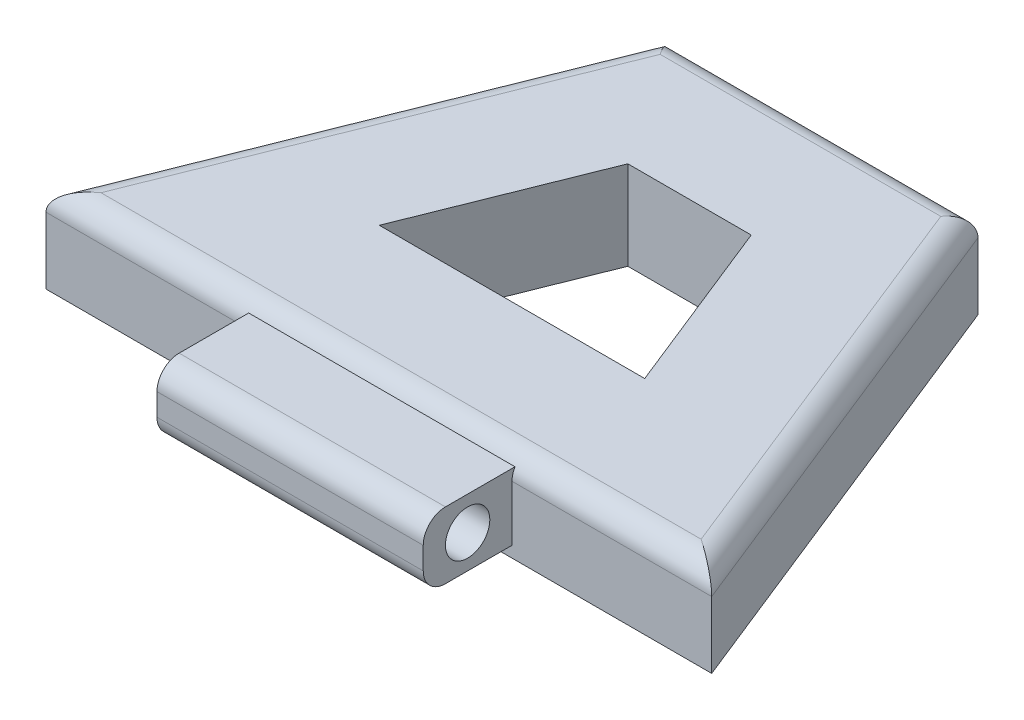
ISO-10303-21;
HEADER;
FILE_DESCRIPTION(('STEP AP214'),'2;1');
FILE_NAME('part.step','',(''),(''),'','','');
FILE_SCHEMA(('AUTOMOTIVE_DESIGN { 1 0 10303 214 1 1 1 1 }'));
ENDSEC;
DATA;
#1=APPLICATION_CONTEXT('core data for automotive mechanical design processes');
#2=APPLICATION_PROTOCOL_DEFINITION('international standard','automotive_design',2000,#1);
#3=PRODUCT_CONTEXT('',#1,'mechanical');
#4=PRODUCT('Part','Part','',(#3));
#5=PRODUCT_RELATED_PRODUCT_CATEGORY('part','',(#4));
#6=PRODUCT_DEFINITION_FORMATION('','',#4);
#7=PRODUCT_DEFINITION_CONTEXT('part definition',#1,'design');
#8=PRODUCT_DEFINITION('design','',#6,#7);
#9=PRODUCT_DEFINITION_SHAPE('','',#8);
#10=(LENGTH_UNIT() NAMED_UNIT(*) SI_UNIT(.MILLI.,.METRE.));
#11=(NAMED_UNIT(*) PLANE_ANGLE_UNIT() SI_UNIT($,.RADIAN.));
#12=(NAMED_UNIT(*) SI_UNIT($,.STERADIAN.) SOLID_ANGLE_UNIT());
#13=UNCERTAINTY_MEASURE_WITH_UNIT(LENGTH_MEASURE(1.E-05),#10,'distance_accuracy_value','');
#14=(GEOMETRIC_REPRESENTATION_CONTEXT(3) GLOBAL_UNCERTAINTY_ASSIGNED_CONTEXT((#13)) GLOBAL_UNIT_ASSIGNED_CONTEXT((#10,
#11,#12)) REPRESENTATION_CONTEXT('',''));
#15=CARTESIAN_POINT('',(0.,0.,0.));
#16=DIRECTION('',(0.,0.,1.));
#17=DIRECTION('',(1.,0.,0.));
#18=AXIS2_PLACEMENT_3D('',#15,#16,#17);
#19=CARTESIAN_POINT('',(75.,20.,0.));
#20=DIRECTION('',(0.,0.,-1.));
#21=DIRECTION('',(-1.,0.,0.));
#22=AXIS2_PLACEMENT_3D('',#19,#20,#21);
#23=PLANE('',#22);
#24=DIRECTION('',(0.,-1.,0.));
#25=VECTOR('',#24,1.);
#26=CARTESIAN_POINT('',(75.,20.,0.));
#27=LINE('',#26,#25);
#28=CARTESIAN_POINT('',(75.,15.,0.));
#29=VERTEX_POINT('',#28);
#30=CARTESIAN_POINT('',(75.,0.,0.));
#31=VERTEX_POINT('',#30);
#32=EDGE_CURVE('E236',#29,#31,#27,.T.);
#33=ORIENTED_EDGE('',*,*,#32,.F.);
#34=DIRECTION('',(1.,0.,0.));
#35=VECTOR('',#34,1.);
#36=CARTESIAN_POINT('',(75.,15.,0.));
#37=LINE('',#36,#35);
#38=CARTESIAN_POINT('',(30.,15.,0.));
#39=VERTEX_POINT('',#38);
#40=EDGE_CURVE('E177',#29,#39,#37,.F.);
#41=ORIENTED_EDGE('',*,*,#40,.T.);
#42=DIRECTION('',(0.,-1.,0.));
#43=VECTOR('',#42,1.);
#44=CARTESIAN_POINT('',(30.,17.5,0.));
#45=LINE('',#44,#43);
#46=CARTESIAN_POINT('',(30.,2.5,0.));
#47=VERTEX_POINT('',#46);
#48=EDGE_CURVE('E163',#39,#47,#45,.T.);
#49=ORIENTED_EDGE('',*,*,#48,.T.);
#50=DIRECTION('',(1.,0.,0.));
#51=VECTOR('',#50,1.);
#52=CARTESIAN_POINT('',(-30.,2.5,0.));
#53=LINE('',#52,#51);
#54=CARTESIAN_POINT('',(-30.,2.5,0.));
#55=VERTEX_POINT('',#54);
#56=EDGE_CURVE('E175',#55,#47,#53,.T.);
#57=ORIENTED_EDGE('',*,*,#56,.F.);
#58=DIRECTION('',(0.,-1.,0.));
#59=VECTOR('',#58,1.);
#60=CARTESIAN_POINT('',(-30.,17.5,0.));
#61=LINE('',#60,#59);
#62=CARTESIAN_POINT('',(-30.,15.,0.));
#63=VERTEX_POINT('',#62);
#64=EDGE_CURVE('E183',#63,#55,#61,.T.);
#65=ORIENTED_EDGE('',*,*,#64,.F.);
#66=DIRECTION('',(1.,0.,0.));
#67=VECTOR('',#66,1.);
#68=CARTESIAN_POINT('',(75.,15.,0.));
#69=LINE('',#68,#67);
#70=CARTESIAN_POINT('',(-75.,15.,0.));
#71=VERTEX_POINT('',#70);
#72=EDGE_CURVE('E253',#63,#71,#69,.F.);
#73=ORIENTED_EDGE('',*,*,#72,.T.);
#74=DIRECTION('',(0.,-1.,0.));
#75=VECTOR('',#74,1.);
#76=CARTESIAN_POINT('',(-75.,20.,0.));
#77=LINE('',#76,#75);
#78=CARTESIAN_POINT('',(-75.,0.,0.));
#79=VERTEX_POINT('',#78);
#80=EDGE_CURVE('E238',#71,#79,#77,.T.);
#81=ORIENTED_EDGE('',*,*,#80,.T.);
#82=DIRECTION('',(1.,0.,0.));
#83=VECTOR('',#82,1.);
#84=CARTESIAN_POINT('',(75.,0.,0.));
#85=LINE('',#84,#83);
#86=EDGE_CURVE('E233',#79,#31,#85,.T.);
#87=ORIENTED_EDGE('',*,*,#86,.T.);
#88=EDGE_LOOP('',(#33,#41,#49,#57,#65,#73,#81,#87));
#89=FACE_BOUND('',#88,.T.);
#90=ADVANCED_FACE('F38',(#89),#23,.F.);
#91=CARTESIAN_POINT('',(0.,20.,0.));
#92=DIRECTION('',(0.,-1.,0.));
#93=DIRECTION('',(0.,0.,-1.));
#94=AXIS2_PLACEMENT_3D('',#91,#92,#93);
#95=PLANE('',#94);
#96=DIRECTION('',(-0.371390676354103,0.,0.92847669088526));
#97=VECTOR('',#96,1.);
#98=CARTESIAN_POINT('',(-60.0127889593668,20.,-24.0051155837467));
#99=LINE('',#98,#97);
#100=CARTESIAN_POINT('',(-31.6148351928655,20.,-95.));
#101=VERTEX_POINT('',#100);
#102=CARTESIAN_POINT('',(-67.6148351928655,20.,-4.99999999999999));
#103=VERTEX_POINT('',#102);
#104=EDGE_CURVE('E248',#101,#103,#99,.T.);
#105=ORIENTED_EDGE('',*,*,#104,.T.);
#106=DIRECTION('',(1.,0.,0.));
#107=VECTOR('',#106,1.);
#108=CARTESIAN_POINT('',(0.,20.,-4.99999999999999));
#109=LINE('',#108,#107);
#110=CARTESIAN_POINT('',(67.6148351928655,20.,-5.));
#111=VERTEX_POINT('',#110);
#112=EDGE_CURVE('E250',#103,#111,#109,.T.);
#113=ORIENTED_EDGE('',*,*,#112,.T.);
#114=DIRECTION('',(-0.371390676354104,0.,-0.92847669088526));
#115=VECTOR('',#114,1.);
#116=CARTESIAN_POINT('',(60.0127889593668,20.,-24.0051155837467));
#117=LINE('',#116,#115);
#118=CARTESIAN_POINT('',(31.6148351928655,20.,-95.));
#119=VERTEX_POINT('',#118);
#120=EDGE_CURVE('E244',#111,#119,#117,.T.);
#121=ORIENTED_EDGE('',*,*,#120,.T.);
#122=DIRECTION('',(-1.,0.,0.));
#123=VECTOR('',#122,1.);
#124=CARTESIAN_POINT('',(0.,20.,-95.));
#125=LINE('',#124,#123);
#126=EDGE_CURVE('E246',#119,#101,#125,.T.);
#127=ORIENTED_EDGE('',*,*,#126,.T.);
#128=EDGE_LOOP('',(#105,#113,#121,#127));
#129=FACE_BOUND('',#128,.T.);
#130=DIRECTION('',(-0.371390676354104,0.,-0.928476690885259));
#131=VECTOR('',#130,1.);
#132=CARTESIAN_POINT('',(13.9,20.,-70.));
#133=LINE('',#132,#131);
#134=CARTESIAN_POINT('',(29.9,20.,-30.));
#135=VERTEX_POINT('',#134);
#136=CARTESIAN_POINT('',(13.9,20.,-70.));
#137=VERTEX_POINT('',#136);
#138=EDGE_CURVE('E194',#135,#137,#133,.T.);
#139=ORIENTED_EDGE('',*,*,#138,.F.);
#140=DIRECTION('',(1.,0.,0.));
#141=VECTOR('',#140,1.);
#142=CARTESIAN_POINT('',(-29.9,20.,-30.));
#143=LINE('',#142,#141);
#144=CARTESIAN_POINT('',(-29.9,20.,-30.));
#145=VERTEX_POINT('',#144);
#146=EDGE_CURVE('E202',#145,#135,#143,.T.);
#147=ORIENTED_EDGE('',*,*,#146,.F.);
#148=DIRECTION('',(-0.371390676354103,0.,0.928476690885259));
#149=VECTOR('',#148,1.);
#150=CARTESIAN_POINT('',(-13.9,20.,-70.));
#151=LINE('',#150,#149);
#152=CARTESIAN_POINT('',(-13.9,20.,-70.));
#153=VERTEX_POINT('',#152);
#154=EDGE_CURVE('E199',#153,#145,#151,.T.);
#155=ORIENTED_EDGE('',*,*,#154,.F.);
#156=DIRECTION('',(-1.,0.,0.));
#157=VECTOR('',#156,1.);
#158=CARTESIAN_POINT('',(-13.9,20.,-70.));
#159=LINE('',#158,#157);
#160=EDGE_CURVE('E196',#137,#153,#159,.T.);
#161=ORIENTED_EDGE('',*,*,#160,.F.);
#162=EDGE_LOOP('',(#139,#147,#155,#161));
#163=FACE_BOUND('',#162,.T.);
#164=ADVANCED_FACE('F332',(#129,#163),#95,.F.);
#165=CARTESIAN_POINT('',(0.,0.,0.));
#166=DIRECTION('',(0.,-1.,0.));
#167=DIRECTION('',(0.,0.,-1.));
#168=AXIS2_PLACEMENT_3D('',#165,#166,#167);
#169=PLANE('',#168);
#170=DIRECTION('',(-0.371390676354104,0.,-0.928476690885259));
#171=VECTOR('',#170,1.);
#172=CARTESIAN_POINT('',(35.,0.,-100.));
#173=LINE('',#172,#171);
#174=CARTESIAN_POINT('',(35.,0.,-100.));
#175=VERTEX_POINT('',#174);
#176=EDGE_CURVE('E224',#31,#175,#173,.T.);
#177=ORIENTED_EDGE('',*,*,#176,.F.);
#178=ORIENTED_EDGE('',*,*,#86,.F.);
#179=DIRECTION('',(-0.371390676354103,0.,0.928476690885259));
#180=VECTOR('',#179,1.);
#181=CARTESIAN_POINT('',(-35.,0.,-100.));
#182=LINE('',#181,#180);
#183=CARTESIAN_POINT('',(-35.,0.,-100.));
#184=VERTEX_POINT('',#183);
#185=EDGE_CURVE('E230',#184,#79,#182,.T.);
#186=ORIENTED_EDGE('',*,*,#185,.F.);
#187=DIRECTION('',(-1.,0.,0.));
#188=VECTOR('',#187,1.);
#189=CARTESIAN_POINT('',(-35.,0.,-100.));
#190=LINE('',#189,#188);
#191=EDGE_CURVE('E227',#175,#184,#190,.T.);
#192=ORIENTED_EDGE('',*,*,#191,.F.);
#193=EDGE_LOOP('',(#177,#178,#186,#192));
#194=FACE_BOUND('',#193,.T.);
#195=DIRECTION('',(1.,0.,0.));
#196=VECTOR('',#195,1.);
#197=CARTESIAN_POINT('',(-29.9,0.,-30.));
#198=LINE('',#197,#196);
#199=CARTESIAN_POINT('',(-29.9,0.,-30.));
#200=VERTEX_POINT('',#199);
#201=CARTESIAN_POINT('',(29.9,0.,-30.));
#202=VERTEX_POINT('',#201);
#203=EDGE_CURVE('E197',#200,#202,#198,.T.);
#204=ORIENTED_EDGE('',*,*,#203,.T.);
#205=DIRECTION('',(-0.371390676354104,0.,-0.928476690885259));
#206=VECTOR('',#205,1.);
#207=CARTESIAN_POINT('',(13.9,0.,-70.));
#208=LINE('',#207,#206);
#209=CARTESIAN_POINT('',(13.9,0.,-70.));
#210=VERTEX_POINT('',#209);
#211=EDGE_CURVE('E193',#202,#210,#208,.T.);
#212=ORIENTED_EDGE('',*,*,#211,.T.);
#213=DIRECTION('',(-1.,0.,0.));
#214=VECTOR('',#213,1.);
#215=CARTESIAN_POINT('',(-13.9,0.,-70.));
#216=LINE('',#215,#214);
#217=CARTESIAN_POINT('',(-13.9,0.,-70.));
#218=VERTEX_POINT('',#217);
#219=EDGE_CURVE('E207',#210,#218,#216,.T.);
#220=ORIENTED_EDGE('',*,*,#219,.T.);
#221=DIRECTION('',(-0.371390676354103,0.,0.928476690885259));
#222=VECTOR('',#221,1.);
#223=CARTESIAN_POINT('',(-13.9,0.,-70.));
#224=LINE('',#223,#222);
#225=EDGE_CURVE('E210',#218,#200,#224,.T.);
#226=ORIENTED_EDGE('',*,*,#225,.T.);
#227=EDGE_LOOP('',(#204,#212,#220,#226));
#228=FACE_BOUND('',#227,.T.);
#229=ADVANCED_FACE('F346',(#194,#228),#169,.T.);
#230=CARTESIAN_POINT('',(35.,20.,-100.));
#231=DIRECTION('',(-0.928476690885259,0.,0.371390676354104));
#232=DIRECTION('',(0.371390676354104,0.,0.928476690885259));
#233=AXIS2_PLACEMENT_3D('',#230,#231,#232);
#234=PLANE('',#233);
#235=DIRECTION('',(0.,-1.,0.));
#236=VECTOR('',#235,1.);
#237=CARTESIAN_POINT('',(35.,20.,-100.));
#238=LINE('',#237,#236);
#239=CARTESIAN_POINT('',(35.,15.,-100.));
#240=VERTEX_POINT('',#239);
#241=EDGE_CURVE('E242',#240,#175,#238,.T.);
#242=ORIENTED_EDGE('',*,*,#241,.F.);
#243=DIRECTION('',(-0.371390676354104,0.,-0.928476690885259));
#244=VECTOR('',#243,1.);
#245=CARTESIAN_POINT('',(35.,15.,-100.));
#246=LINE('',#245,#244);
#247=EDGE_CURVE('E260',#240,#29,#246,.F.);
#248=ORIENTED_EDGE('',*,*,#247,.T.);
#249=ORIENTED_EDGE('',*,*,#32,.T.);
#250=ORIENTED_EDGE('',*,*,#176,.T.);
#251=EDGE_LOOP('',(#242,#248,#249,#250));
#252=FACE_BOUND('',#251,.T.);
#253=ADVANCED_FACE('F343',(#252),#234,.F.);
#254=CARTESIAN_POINT('',(-35.,20.,-100.));
#255=DIRECTION('',(0.,0.,1.));
#256=DIRECTION('',(1.,0.,0.));
#257=AXIS2_PLACEMENT_3D('',#254,#255,#256);
#258=PLANE('',#257);
#259=DIRECTION('',(0.,-1.,0.));
#260=VECTOR('',#259,1.);
#261=CARTESIAN_POINT('',(-35.,20.,-100.));
#262=LINE('',#261,#260);
#263=CARTESIAN_POINT('',(-35.,15.,-100.));
#264=VERTEX_POINT('',#263);
#265=EDGE_CURVE('E240',#264,#184,#262,.T.);
#266=ORIENTED_EDGE('',*,*,#265,.F.);
#267=DIRECTION('',(-1.,0.,0.));
#268=VECTOR('',#267,1.);
#269=CARTESIAN_POINT('',(-35.,15.,-100.));
#270=LINE('',#269,#268);
#271=EDGE_CURVE('E258',#264,#240,#270,.F.);
#272=ORIENTED_EDGE('',*,*,#271,.T.);
#273=ORIENTED_EDGE('',*,*,#241,.T.);
#274=ORIENTED_EDGE('',*,*,#191,.T.);
#275=EDGE_LOOP('',(#266,#272,#273,#274));
#276=FACE_BOUND('',#275,.T.);
#277=ADVANCED_FACE('F340',(#276),#258,.F.);
#278=CARTESIAN_POINT('',(-35.,20.,-100.));
#279=DIRECTION('',(0.928476690885259,0.,0.371390676354103));
#280=DIRECTION('',(0.371390676354103,0.,-0.928476690885259));
#281=AXIS2_PLACEMENT_3D('',#278,#279,#280);
#282=PLANE('',#281);
#283=ORIENTED_EDGE('',*,*,#80,.F.);
#284=DIRECTION('',(-0.371390676354103,0.,0.928476690885259));
#285=VECTOR('',#284,1.);
#286=CARTESIAN_POINT('',(-35.,15.,-100.));
#287=LINE('',#286,#285);
#288=EDGE_CURVE('E256',#71,#264,#287,.F.);
#289=ORIENTED_EDGE('',*,*,#288,.T.);
#290=ORIENTED_EDGE('',*,*,#265,.T.);
#291=ORIENTED_EDGE('',*,*,#185,.T.);
#292=EDGE_LOOP('',(#283,#289,#290,#291));
#293=FACE_BOUND('',#292,.T.);
#294=ADVANCED_FACE('F323',(#293),#282,.F.);
#295=CARTESIAN_POINT('',(13.9,20.,-70.));
#296=DIRECTION('',(-0.928476690885259,0.,0.371390676354104));
#297=DIRECTION('',(0.371390676354104,0.,0.928476690885259));
#298=AXIS2_PLACEMENT_3D('',#295,#296,#297);
#299=PLANE('',#298);
#300=ORIENTED_EDGE('',*,*,#211,.F.);
#301=DIRECTION('',(0.,-1.,0.));
#302=VECTOR('',#301,1.);
#303=CARTESIAN_POINT('',(29.9,20.,-30.));
#304=LINE('',#303,#302);
#305=EDGE_CURVE('E204',#135,#202,#304,.T.);
#306=ORIENTED_EDGE('',*,*,#305,.F.);
#307=ORIENTED_EDGE('',*,*,#138,.T.);
#308=DIRECTION('',(0.,-1.,0.));
#309=VECTOR('',#308,1.);
#310=CARTESIAN_POINT('',(13.9,20.,-70.));
#311=LINE('',#310,#309);
#312=EDGE_CURVE('E221',#137,#210,#311,.T.);
#313=ORIENTED_EDGE('',*,*,#312,.T.);
#314=EDGE_LOOP('',(#300,#306,#307,#313));
#315=FACE_BOUND('',#314,.T.);
#316=ADVANCED_FACE('F368',(#315),#299,.T.);
#317=CARTESIAN_POINT('',(-13.9,20.,-70.));
#318=DIRECTION('',(0.,0.,1.));
#319=DIRECTION('',(1.,0.,0.));
#320=AXIS2_PLACEMENT_3D('',#317,#318,#319);
#321=PLANE('',#320);
#322=ORIENTED_EDGE('',*,*,#219,.F.);
#323=ORIENTED_EDGE('',*,*,#312,.F.);
#324=ORIENTED_EDGE('',*,*,#160,.T.);
#325=DIRECTION('',(0.,-1.,0.));
#326=VECTOR('',#325,1.);
#327=CARTESIAN_POINT('',(-13.9,20.,-70.));
#328=LINE('',#327,#326);
#329=EDGE_CURVE('E219',#153,#218,#328,.T.);
#330=ORIENTED_EDGE('',*,*,#329,.T.);
#331=EDGE_LOOP('',(#322,#323,#324,#330));
#332=FACE_BOUND('',#331,.T.);
#333=ADVANCED_FACE('F513',(#332),#321,.T.);
#334=CARTESIAN_POINT('',(-13.9,20.,-70.));
#335=DIRECTION('',(0.928476690885259,0.,0.371390676354103));
#336=DIRECTION('',(0.371390676354103,0.,-0.928476690885259));
#337=AXIS2_PLACEMENT_3D('',#334,#335,#336);
#338=PLANE('',#337);
#339=ORIENTED_EDGE('',*,*,#225,.F.);
#340=ORIENTED_EDGE('',*,*,#329,.F.);
#341=ORIENTED_EDGE('',*,*,#154,.T.);
#342=DIRECTION('',(0.,-1.,0.));
#343=VECTOR('',#342,1.);
#344=CARTESIAN_POINT('',(-29.9,20.,-30.));
#345=LINE('',#344,#343);
#346=EDGE_CURVE('E217',#145,#200,#345,.T.);
#347=ORIENTED_EDGE('',*,*,#346,.T.);
#348=EDGE_LOOP('',(#339,#340,#341,#347));
#349=FACE_BOUND('',#348,.T.);
#350=ADVANCED_FACE('F503',(#349),#338,.T.);
#351=CARTESIAN_POINT('',(-29.9,20.,-30.));
#352=DIRECTION('',(0.,0.,-1.));
#353=DIRECTION('',(-1.,0.,0.));
#354=AXIS2_PLACEMENT_3D('',#351,#352,#353);
#355=PLANE('',#354);
#356=ORIENTED_EDGE('',*,*,#203,.F.);
#357=ORIENTED_EDGE('',*,*,#346,.F.);
#358=ORIENTED_EDGE('',*,*,#146,.T.);
#359=ORIENTED_EDGE('',*,*,#305,.T.);
#360=EDGE_LOOP('',(#356,#357,#358,#359));
#361=FACE_BOUND('',#360,.T.);
#362=ADVANCED_FACE('F412',(#361),#355,.T.);
#363=CARTESIAN_POINT('',(-30.,17.5,20.));
#364=DIRECTION('',(1.,0.,0.));
#365=DIRECTION('',(0.,1.,0.));
#366=AXIS2_PLACEMENT_3D('',#363,#364,#365);
#367=PLANE('',#366);
#368=CARTESIAN_POINT('',(-30.,10.,10.));
#369=DIRECTION('',(1.,0.,0.));
#370=DIRECTION('',(0.,1.,0.));
#371=AXIS2_PLACEMENT_3D('',#368,#369,#370);
#372=CIRCLE('',#371,5.);
#373=CARTESIAN_POINT('',(-30.,15.,10.));
#374=VERTEX_POINT('',#373);
#375=EDGE_CURVE('E185',#374,#374,#372,.T.);
#376=ORIENTED_EDGE('',*,*,#375,.T.);
#377=EDGE_LOOP('',(#376));
#378=FACE_BOUND('',#377,.T.);
#379=DIRECTION('',(0.,0.,-1.));
#380=VECTOR('',#379,1.);
#381=CARTESIAN_POINT('',(-30.,2.5,20.));
#382=LINE('',#381,#380);
#383=CARTESIAN_POINT('',(-30.,2.5,15.));
#384=VERTEX_POINT('',#383);
#385=EDGE_CURVE('E168',#384,#55,#382,.T.);
#386=ORIENTED_EDGE('',*,*,#385,.F.);
#387=CARTESIAN_POINT('',(-30.,7.5,15.));
#388=DIRECTION('',(1.,0.,0.));
#389=DIRECTION('',(0.,1.,0.));
#390=AXIS2_PLACEMENT_3D('',#387,#388,#389);
#391=CIRCLE('',#390,5.);
#392=CARTESIAN_POINT('',(-30.,7.5,20.));
#393=VERTEX_POINT('',#392);
#394=EDGE_CURVE('E274',#384,#393,#391,.F.);
#395=ORIENTED_EDGE('',*,*,#394,.T.);
#396=DIRECTION('',(0.,-1.,0.));
#397=VECTOR('',#396,1.);
#398=CARTESIAN_POINT('',(-30.,17.5,20.));
#399=LINE('',#398,#397);
#400=CARTESIAN_POINT('',(-30.,12.5,20.));
#401=VERTEX_POINT('',#400);
#402=EDGE_CURVE('E178',#401,#393,#399,.T.);
#403=ORIENTED_EDGE('',*,*,#402,.F.);
#404=CARTESIAN_POINT('',(-30.,12.5,15.));
#405=DIRECTION('',(1.,0.,0.));
#406=DIRECTION('',(0.,1.,0.));
#407=AXIS2_PLACEMENT_3D('',#404,#405,#406);
#408=CIRCLE('',#407,5.);
#409=CARTESIAN_POINT('',(-30.,17.5,15.));
#410=VERTEX_POINT('',#409);
#411=EDGE_CURVE('E272',#401,#410,#408,.F.);
#412=ORIENTED_EDGE('',*,*,#411,.T.);
#413=DIRECTION('',(0.,0.,-1.));
#414=VECTOR('',#413,1.);
#415=CARTESIAN_POINT('',(-30.,17.5,20.));
#416=LINE('',#415,#414);
#417=CARTESIAN_POINT('',(-30.,17.5,-0.669872981077797));
#418=VERTEX_POINT('',#417);
#419=EDGE_CURVE('E54',#410,#418,#416,.T.);
#420=ORIENTED_EDGE('',*,*,#419,.T.);
#421=CARTESIAN_POINT('',(-30.,15.,-4.99999999999999));
#422=DIRECTION('',(1.,0.,0.));
#423=DIRECTION('',(0.,1.,0.));
#424=AXIS2_PLACEMENT_3D('',#421,#422,#423);
#425=CIRCLE('',#424,5.);
#426=EDGE_CURVE('E11',#418,#63,#425,.T.);
#427=ORIENTED_EDGE('',*,*,#426,.T.);
#428=ORIENTED_EDGE('',*,*,#64,.T.);
#429=EDGE_LOOP('',(#386,#395,#403,#412,#420,#427,#428));
#430=FACE_BOUND('',#429,.T.);
#431=ADVANCED_FACE('F314',(#378,#430),#367,.F.);
#432=CARTESIAN_POINT('',(-30.,2.5,20.));
#433=DIRECTION('',(0.,1.,0.));
#434=DIRECTION('',(0.,0.,1.));
#435=AXIS2_PLACEMENT_3D('',#432,#433,#434);
#436=PLANE('',#435);
#437=DIRECTION('',(0.,0.,-1.));
#438=VECTOR('',#437,1.);
#439=CARTESIAN_POINT('',(30.,2.5,20.));
#440=LINE('',#439,#438);
#441=CARTESIAN_POINT('',(30.,2.5,15.));
#442=VERTEX_POINT('',#441);
#443=EDGE_CURVE('E159',#442,#47,#440,.T.);
#444=ORIENTED_EDGE('',*,*,#443,.F.);
#445=DIRECTION('',(1.,0.,0.));
#446=VECTOR('',#445,1.);
#447=CARTESIAN_POINT('',(-30.,2.5,15.));
#448=LINE('',#447,#446);
#449=EDGE_CURVE('E270',#442,#384,#448,.F.);
#450=ORIENTED_EDGE('',*,*,#449,.T.);
#451=ORIENTED_EDGE('',*,*,#385,.T.);
#452=ORIENTED_EDGE('',*,*,#56,.T.);
#453=EDGE_LOOP('',(#444,#450,#451,#452));
#454=FACE_BOUND('',#453,.T.);
#455=ADVANCED_FACE('F180',(#454),#436,.F.);
#456=CARTESIAN_POINT('',(30.,17.5,20.));
#457=DIRECTION('',(1.,0.,0.));
#458=DIRECTION('',(0.,0.,-1.));
#459=AXIS2_PLACEMENT_3D('',#456,#457,#458);
#460=PLANE('',#459);
#461=CARTESIAN_POINT('',(30.,10.,10.));
#462=DIRECTION('',(1.,0.,0.));
#463=DIRECTION('',(0.,0.,-1.));
#464=AXIS2_PLACEMENT_3D('',#461,#462,#463);
#465=CIRCLE('',#464,5.);
#466=CARTESIAN_POINT('',(30.,10.,5.));
#467=VERTEX_POINT('',#466);
#468=EDGE_CURVE('E292',#467,#467,#465,.T.);
#469=ORIENTED_EDGE('',*,*,#468,.F.);
#470=EDGE_LOOP('',(#469));
#471=FACE_BOUND('',#470,.T.);
#472=DIRECTION('',(0.,-1.,0.));
#473=VECTOR('',#472,1.);
#474=CARTESIAN_POINT('',(30.,17.5,20.));
#475=LINE('',#474,#473);
#476=CARTESIAN_POINT('',(30.,12.5,20.));
#477=VERTEX_POINT('',#476);
#478=CARTESIAN_POINT('',(30.,7.5,20.));
#479=VERTEX_POINT('',#478);
#480=EDGE_CURVE('E190',#477,#479,#475,.T.);
#481=ORIENTED_EDGE('',*,*,#480,.T.);
#482=CARTESIAN_POINT('',(30.,7.5,15.));
#483=DIRECTION('',(1.,0.,0.));
#484=DIRECTION('',(0.,0.,-1.));
#485=AXIS2_PLACEMENT_3D('',#482,#483,#484);
#486=CIRCLE('',#485,5.);
#487=EDGE_CURVE('E164',#479,#442,#486,.T.);
#488=ORIENTED_EDGE('',*,*,#487,.T.);
#489=ORIENTED_EDGE('',*,*,#443,.T.);
#490=ORIENTED_EDGE('',*,*,#48,.F.);
#491=CARTESIAN_POINT('',(30.,15.,-5.));
#492=DIRECTION('',(1.,0.,0.));
#493=DIRECTION('',(0.,0.,-1.));
#494=AXIS2_PLACEMENT_3D('',#491,#492,#493);
#495=CIRCLE('',#494,5.);
#496=CARTESIAN_POINT('',(30.,17.5,-0.669872981077804));
#497=VERTEX_POINT('',#496);
#498=EDGE_CURVE('E278',#39,#497,#495,.F.);
#499=ORIENTED_EDGE('',*,*,#498,.T.);
#500=DIRECTION('',(0.,0.,-1.));
#501=VECTOR('',#500,1.);
#502=CARTESIAN_POINT('',(30.,17.5,20.));
#503=LINE('',#502,#501);
#504=CARTESIAN_POINT('',(30.,17.5,15.));
#505=VERTEX_POINT('',#504);
#506=EDGE_CURVE('E61',#505,#497,#503,.T.);
#507=ORIENTED_EDGE('',*,*,#506,.F.);
#508=CARTESIAN_POINT('',(30.,12.5,15.));
#509=DIRECTION('',(1.,0.,0.));
#510=DIRECTION('',(0.,0.,-1.));
#511=AXIS2_PLACEMENT_3D('',#508,#509,#510);
#512=CIRCLE('',#511,5.);
#513=EDGE_CURVE('E267',#505,#477,#512,.T.);
#514=ORIENTED_EDGE('',*,*,#513,.T.);
#515=EDGE_LOOP('',(#481,#488,#489,#490,#499,#507,#514));
#516=FACE_BOUND('',#515,.T.);
#517=ADVANCED_FACE('F162',(#471,#516),#460,.T.);
#518=CARTESIAN_POINT('',(-30.,17.5,20.));
#519=DIRECTION('',(0.,1.,0.));
#520=DIRECTION('',(0.,0.,1.));
#521=AXIS2_PLACEMENT_3D('',#518,#519,#520);
#522=PLANE('',#521);
#523=ORIENTED_EDGE('',*,*,#419,.F.);
#524=DIRECTION('',(1.,0.,0.));
#525=VECTOR('',#524,1.);
#526=CARTESIAN_POINT('',(-30.,17.5,15.));
#527=LINE('',#526,#525);
#528=EDGE_CURVE('E276',#410,#505,#527,.T.);
#529=ORIENTED_EDGE('',*,*,#528,.T.);
#530=ORIENTED_EDGE('',*,*,#506,.T.);
#531=DIRECTION('',(1.,0.,0.));
#532=VECTOR('',#531,1.);
#533=CARTESIAN_POINT('',(30.,17.5,-0.669872981077805));
#534=LINE('',#533,#532);
#535=EDGE_CURVE('E47',#497,#418,#534,.F.);
#536=ORIENTED_EDGE('',*,*,#535,.T.);
#537=EDGE_LOOP('',(#523,#529,#530,#536));
#538=FACE_BOUND('',#537,.T.);
#539=ADVANCED_FACE('F315',(#538),#522,.T.);
#540=CARTESIAN_POINT('',(0.,0.,20.));
#541=DIRECTION('',(0.,0.,1.));
#542=DIRECTION('',(1.,0.,0.));
#543=AXIS2_PLACEMENT_3D('',#540,#541,#542);
#544=PLANE('',#543);
#545=ORIENTED_EDGE('',*,*,#402,.T.);
#546=DIRECTION('',(1.,0.,0.));
#547=VECTOR('',#546,1.);
#548=CARTESIAN_POINT('',(30.,7.5,20.));
#549=LINE('',#548,#547);
#550=EDGE_CURVE('E264',#393,#479,#549,.T.);
#551=ORIENTED_EDGE('',*,*,#550,.T.);
#552=ORIENTED_EDGE('',*,*,#480,.F.);
#553=DIRECTION('',(1.,0.,0.));
#554=VECTOR('',#553,1.);
#555=CARTESIAN_POINT('',(0.,12.5,20.));
#556=LINE('',#555,#554);
#557=EDGE_CURVE('E262',#477,#401,#556,.F.);
#558=ORIENTED_EDGE('',*,*,#557,.T.);
#559=EDGE_LOOP('',(#545,#551,#552,#558));
#560=FACE_BOUND('',#559,.T.);
#561=ADVANCED_FACE('F308',(#560),#544,.T.);
#562=CARTESIAN_POINT('',(-75.,10.,10.));
#563=DIRECTION('',(1.,0.,0.));
#564=DIRECTION('',(0.,0.,-1.));
#565=AXIS2_PLACEMENT_3D('',#562,#563,#564);
#566=CYLINDRICAL_SURFACE('',#565,5.);
#567=ORIENTED_EDGE('',*,*,#468,.T.);
#568=EDGE_LOOP('',(#567));
#569=FACE_BOUND('',#568,.T.);
#570=ORIENTED_EDGE('',*,*,#375,.F.);
#571=EDGE_LOOP('',(#570));
#572=FACE_BOUND('',#571,.T.);
#573=ADVANCED_FACE('F448',(#569,#572),#566,.F.);
#574=CARTESIAN_POINT('',(0.,15.,-95.));
#575=DIRECTION('',(-1.,0.,0.));
#576=DIRECTION('',(0.,0.,1.));
#577=AXIS2_PLACEMENT_3D('',#574,#575,#576);
#578=CYLINDRICAL_SURFACE('',#577,5.);
#579=CARTESIAN_POINT('',(31.6148351928655,15.,-95.));
#580=DIRECTION('',(-0.828067230469273,0.,-0.560628809305184));
#581=DIRECTION('',(0.560628809305184,0.,-0.828067230469273));
#582=AXIS2_PLACEMENT_3D('',#579,#580,#581);
#583=ELLIPSE('',#582,6.03815706747199,5.);
#584=EDGE_CURVE('E285',#240,#119,#583,.F.);
#585=ORIENTED_EDGE('',*,*,#584,.F.);
#586=ORIENTED_EDGE('',*,*,#271,.F.);
#587=CARTESIAN_POINT('',(-31.6148351928655,15.,-95.));
#588=DIRECTION('',(-0.828067230469273,0.,0.560628809305184));
#589=DIRECTION('',(-0.560628809305184,0.,-0.828067230469273));
#590=AXIS2_PLACEMENT_3D('',#587,#588,#589);
#591=ELLIPSE('',#590,6.03815706747199,5.);
#592=EDGE_CURVE('E42',#101,#264,#591,.T.);
#593=ORIENTED_EDGE('',*,*,#592,.F.);
#594=ORIENTED_EDGE('',*,*,#126,.F.);
#595=EDGE_LOOP('',(#585,#586,#593,#594));
#596=FACE_BOUND('',#595,.T.);
#597=ADVANCED_FACE('F337',(#596),#578,.T.);
#598=CARTESIAN_POINT('',(-60.0127889593668,15.,-24.0051155837467));
#599=DIRECTION('',(-0.371390676354103,0.,0.92847669088526));
#600=DIRECTION('',(0.92847669088526,0.,0.371390676354103));
#601=AXIS2_PLACEMENT_3D('',#598,#599,#600);
#602=CYLINDRICAL_SURFACE('',#601,5.);
#603=ORIENTED_EDGE('',*,*,#592,.T.);
#604=ORIENTED_EDGE('',*,*,#288,.F.);
#605=CARTESIAN_POINT('',(-67.6148351928655,15.,-4.99999999999999));
#606=DIRECTION('',(0.560628809305184,0.,0.828067230469273));
#607=DIRECTION('',(-0.828067230469273,0.,0.560628809305184));
#608=AXIS2_PLACEMENT_3D('',#605,#606,#607);
#609=ELLIPSE('',#608,8.91855701492893,5.);
#610=EDGE_CURVE('E283',#103,#71,#609,.T.);
#611=ORIENTED_EDGE('',*,*,#610,.F.);
#612=ORIENTED_EDGE('',*,*,#104,.F.);
#613=EDGE_LOOP('',(#603,#604,#611,#612));
#614=FACE_BOUND('',#613,.T.);
#615=ADVANCED_FACE('F328',(#614),#602,.T.);
#616=CARTESIAN_POINT('',(60.0127889593668,15.,-24.0051155837467));
#617=DIRECTION('',(-0.371390676354104,0.,-0.92847669088526));
#618=DIRECTION('',(-0.928476690885259,0.,0.371390676354104));
#619=AXIS2_PLACEMENT_3D('',#616,#617,#618);
#620=CYLINDRICAL_SURFACE('',#619,5.);
#621=ORIENTED_EDGE('',*,*,#584,.T.);
#622=ORIENTED_EDGE('',*,*,#120,.F.);
#623=CARTESIAN_POINT('',(67.6148351928655,15.,-5.));
#624=DIRECTION('',(0.560628809305184,0.,-0.828067230469273));
#625=DIRECTION('',(-0.828067230469273,0.,-0.560628809305184));
#626=AXIS2_PLACEMENT_3D('',#623,#624,#625);
#627=ELLIPSE('',#626,8.91855701492893,5.);
#628=EDGE_CURVE('E281',#29,#111,#627,.F.);
#629=ORIENTED_EDGE('',*,*,#628,.F.);
#630=ORIENTED_EDGE('',*,*,#247,.F.);
#631=EDGE_LOOP('',(#621,#622,#629,#630));
#632=FACE_BOUND('',#631,.T.);
#633=ADVANCED_FACE('F348',(#632),#620,.T.);
#634=CARTESIAN_POINT('',(0.,15.,-4.99999999999999));
#635=DIRECTION('',(1.,0.,0.));
#636=DIRECTION('',(0.,0.,-1.));
#637=AXIS2_PLACEMENT_3D('',#634,#635,#636);
#638=CYLINDRICAL_SURFACE('',#637,5.);
#639=ORIENTED_EDGE('',*,*,#498,.F.);
#640=ORIENTED_EDGE('',*,*,#40,.F.);
#641=ORIENTED_EDGE('',*,*,#628,.T.);
#642=ORIENTED_EDGE('',*,*,#112,.F.);
#643=ORIENTED_EDGE('',*,*,#610,.T.);
#644=ORIENTED_EDGE('',*,*,#72,.F.);
#645=ORIENTED_EDGE('',*,*,#426,.F.);
#646=ORIENTED_EDGE('',*,*,#535,.F.);
#647=EDGE_LOOP('',(#639,#640,#641,#642,#643,#644,#645,#646));
#648=FACE_BOUND('',#647,.T.);
#649=ADVANCED_FACE('F320',(#648),#638,.T.);
#650=CARTESIAN_POINT('',(0.,7.5,15.));
#651=DIRECTION('',(-1.,0.,0.));
#652=DIRECTION('',(0.,0.,1.));
#653=AXIS2_PLACEMENT_3D('',#650,#651,#652);
#654=CYLINDRICAL_SURFACE('',#653,5.);
#655=ORIENTED_EDGE('',*,*,#394,.F.);
#656=ORIENTED_EDGE('',*,*,#449,.F.);
#657=ORIENTED_EDGE('',*,*,#487,.F.);
#658=ORIENTED_EDGE('',*,*,#550,.F.);
#659=EDGE_LOOP('',(#655,#656,#657,#658));
#660=FACE_BOUND('',#659,.T.);
#661=ADVANCED_FACE('F355',(#660),#654,.T.);
#662=CARTESIAN_POINT('',(-30.,12.5,15.));
#663=DIRECTION('',(1.,0.,0.));
#664=DIRECTION('',(0.,0.,-1.));
#665=AXIS2_PLACEMENT_3D('',#662,#663,#664);
#666=CYLINDRICAL_SURFACE('',#665,5.);
#667=ORIENTED_EDGE('',*,*,#411,.F.);
#668=ORIENTED_EDGE('',*,*,#557,.F.);
#669=ORIENTED_EDGE('',*,*,#513,.F.);
#670=ORIENTED_EDGE('',*,*,#528,.F.);
#671=EDGE_LOOP('',(#667,#668,#669,#670));
#672=FACE_BOUND('',#671,.T.);
#673=ADVANCED_FACE('F40',(#672),#666,.T.);
#674=CLOSED_SHELL('',(#90,#164,#229,#253,#277,#294,#316,#333,#350,#362,#431,#455,#517,#539,#561,
#573,#597,#615,#633,#649,#661,#673));
#675=MANIFOLD_SOLID_BREP('B2',#674);
#676=ADVANCED_BREP_SHAPE_REPRESENTATION('',(#18,#675),#14);
#677=SHAPE_DEFINITION_REPRESENTATION(#9,#676);
ENDSEC;
END-ISO-10303-21;
